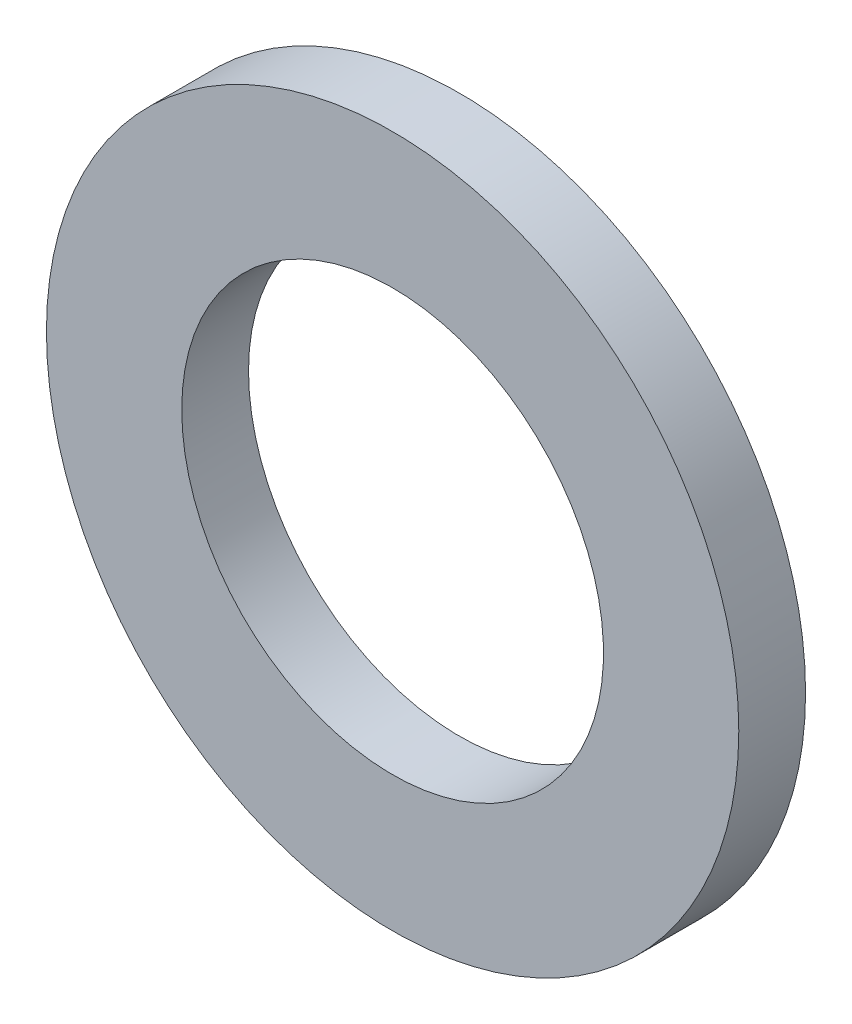
ISO-10303-21;
HEADER;
FILE_DESCRIPTION(('STEP AP214'),'2;1');
FILE_NAME('part.step','',(''),(''),'','','');
FILE_SCHEMA(('AUTOMOTIVE_DESIGN { 1 0 10303 214 1 1 1 1 }'));
ENDSEC;
DATA;
#1=APPLICATION_CONTEXT('core data for automotive mechanical design processes');
#2=APPLICATION_PROTOCOL_DEFINITION('international standard','automotive_design',2000,#1);
#3=PRODUCT_CONTEXT('',#1,'mechanical');
#4=PRODUCT('Part','Part','',(#3));
#5=PRODUCT_RELATED_PRODUCT_CATEGORY('part','',(#4));
#6=PRODUCT_DEFINITION_FORMATION('','',#4);
#7=PRODUCT_DEFINITION_CONTEXT('part definition',#1,'design');
#8=PRODUCT_DEFINITION('design','',#6,#7);
#9=PRODUCT_DEFINITION_SHAPE('','',#8);
#10=(LENGTH_UNIT() NAMED_UNIT(*) SI_UNIT(.MILLI.,.METRE.));
#11=(NAMED_UNIT(*) PLANE_ANGLE_UNIT() SI_UNIT($,.RADIAN.));
#12=(NAMED_UNIT(*) SI_UNIT($,.STERADIAN.) SOLID_ANGLE_UNIT());
#13=UNCERTAINTY_MEASURE_WITH_UNIT(LENGTH_MEASURE(1.E-05),#10,'distance_accuracy_value','');
#14=(GEOMETRIC_REPRESENTATION_CONTEXT(3) GLOBAL_UNCERTAINTY_ASSIGNED_CONTEXT((#13)) GLOBAL_UNIT_ASSIGNED_CONTEXT((#10,
#11,#12)) REPRESENTATION_CONTEXT('',''));
#15=CARTESIAN_POINT('',(0.,0.,0.));
#16=DIRECTION('',(0.,0.,1.));
#17=DIRECTION('',(1.,0.,0.));
#18=AXIS2_PLACEMENT_3D('',#15,#16,#17);
#19=CARTESIAN_POINT('',(0.,0.,0.95));
#20=DIRECTION('',(0.,0.,1.));
#21=DIRECTION('',(1.,0.,0.));
#22=AXIS2_PLACEMENT_3D('',#19,#20,#21);
#23=PLANE('',#22);
#24=CARTESIAN_POINT('',(0.,0.,0.95));
#25=DIRECTION('',(0.,0.,1.));
#26=DIRECTION('',(1.,0.,0.));
#27=AXIS2_PLACEMENT_3D('',#24,#25,#26);
#28=CIRCLE('',#27,4.925);
#29=CARTESIAN_POINT('',(-4.925,0.,0.95));
#30=VERTEX_POINT('',#29);
#31=EDGE_CURVE('E12',#30,#30,#28,.T.);
#32=ORIENTED_EDGE('',*,*,#31,.T.);
#33=EDGE_LOOP('',(#32));
#34=FACE_BOUND('',#33,.T.);
#35=CARTESIAN_POINT('',(0.,0.,0.95));
#36=DIRECTION('',(0.,0.,1.));
#37=DIRECTION('',(1.,0.,0.));
#38=AXIS2_PLACEMENT_3D('',#35,#36,#37);
#39=CIRCLE('',#38,3.);
#40=CARTESIAN_POINT('',(-3.,0.,0.95));
#41=VERTEX_POINT('',#40);
#42=EDGE_CURVE('E56',#41,#41,#39,.T.);
#43=ORIENTED_EDGE('',*,*,#42,.F.);
#44=EDGE_LOOP('',(#43));
#45=FACE_BOUND('',#44,.T.);
#46=ADVANCED_FACE('F44',(#34,#45),#23,.T.);
#47=CARTESIAN_POINT('',(0.,0.,0.));
#48=DIRECTION('',(0.,0.,1.));
#49=DIRECTION('',(1.,0.,0.));
#50=AXIS2_PLACEMENT_3D('',#47,#48,#49);
#51=PLANE('',#50);
#52=CARTESIAN_POINT('',(0.,0.,0.));
#53=DIRECTION('',(0.,0.,1.));
#54=DIRECTION('',(1.,0.,0.));
#55=AXIS2_PLACEMENT_3D('',#52,#53,#54);
#56=CIRCLE('',#55,4.925);
#57=CARTESIAN_POINT('',(-4.925,0.,0.));
#58=VERTEX_POINT('',#57);
#59=EDGE_CURVE('E48',#58,#58,#56,.T.);
#60=ORIENTED_EDGE('',*,*,#59,.F.);
#61=EDGE_LOOP('',(#60));
#62=FACE_BOUND('',#61,.T.);
#63=CARTESIAN_POINT('',(0.,0.,0.));
#64=DIRECTION('',(0.,0.,1.));
#65=DIRECTION('',(1.,0.,0.));
#66=AXIS2_PLACEMENT_3D('',#63,#64,#65);
#67=CIRCLE('',#66,3.);
#68=CARTESIAN_POINT('',(-3.,0.,0.));
#69=VERTEX_POINT('',#68);
#70=EDGE_CURVE('E58',#69,#69,#67,.T.);
#71=ORIENTED_EDGE('',*,*,#70,.T.);
#72=EDGE_LOOP('',(#71));
#73=FACE_BOUND('',#72,.T.);
#74=ADVANCED_FACE('F69',(#62,#73),#51,.F.);
#75=CARTESIAN_POINT('',(0.,0.,0.95));
#76=DIRECTION('',(0.,0.,-1.));
#77=DIRECTION('',(-1.,0.,0.));
#78=AXIS2_PLACEMENT_3D('',#75,#76,#77);
#79=CYLINDRICAL_SURFACE('',#78,4.925);
#80=CARTESIAN_POINT('',(-4.925,0.,0.95));
#81=CARTESIAN_POINT('',(-4.925,0.,0.940104166666667));
#82=CARTESIAN_POINT('',(-4.925,0.,0.930208333333333));
#83=CARTESIAN_POINT('',(-4.925,0.,0.910416666666667));
#84=CARTESIAN_POINT('',(-4.925,0.,0.900520833333333));
#85=CARTESIAN_POINT('',(-4.925,0.,0.880729166666667));
#86=CARTESIAN_POINT('',(-4.925,0.,0.870833333333333));
#87=CARTESIAN_POINT('',(-4.925,0.,0.851041666666667));
#88=CARTESIAN_POINT('',(-4.925,0.,0.841145833333333));
#89=CARTESIAN_POINT('',(-4.925,0.,0.821354166666667));
#90=CARTESIAN_POINT('',(-4.925,0.,0.811458333333333));
#91=CARTESIAN_POINT('',(-4.925,0.,0.791666666666667));
#92=CARTESIAN_POINT('',(-4.925,0.,0.781770833333333));
#93=CARTESIAN_POINT('',(-4.925,0.,0.761979166666667));
#94=CARTESIAN_POINT('',(-4.925,0.,0.752083333333333));
#95=CARTESIAN_POINT('',(-4.925,0.,0.732291666666667));
#96=CARTESIAN_POINT('',(-4.925,0.,0.722395833333333));
#97=CARTESIAN_POINT('',(-4.925,0.,0.702604166666667));
#98=CARTESIAN_POINT('',(-4.925,0.,0.692708333333333));
#99=CARTESIAN_POINT('',(-4.925,0.,0.672916666666667));
#100=CARTESIAN_POINT('',(-4.925,0.,0.663020833333333));
#101=CARTESIAN_POINT('',(-4.925,0.,0.643229166666667));
#102=CARTESIAN_POINT('',(-4.925,0.,0.633333333333333));
#103=CARTESIAN_POINT('',(-4.925,0.,0.613541666666667));
#104=CARTESIAN_POINT('',(-4.925,0.,0.603645833333333));
#105=CARTESIAN_POINT('',(-4.925,0.,0.583854166666667));
#106=CARTESIAN_POINT('',(-4.925,0.,0.573958333333333));
#107=CARTESIAN_POINT('',(-4.925,0.,0.554166666666667));
#108=CARTESIAN_POINT('',(-4.925,0.,0.544270833333333));
#109=CARTESIAN_POINT('',(-4.925,0.,0.524479166666667));
#110=CARTESIAN_POINT('',(-4.925,0.,0.514583333333333));
#111=CARTESIAN_POINT('',(-4.925,0.,0.494791666666667));
#112=CARTESIAN_POINT('',(-4.925,0.,0.484895833333333));
#113=CARTESIAN_POINT('',(-4.925,0.,0.465104166666667));
#114=CARTESIAN_POINT('',(-4.925,0.,0.455208333333333));
#115=CARTESIAN_POINT('',(-4.925,0.,0.435416666666667));
#116=CARTESIAN_POINT('',(-4.925,0.,0.425520833333333));
#117=CARTESIAN_POINT('',(-4.925,0.,0.405729166666667));
#118=CARTESIAN_POINT('',(-4.925,0.,0.395833333333333));
#119=CARTESIAN_POINT('',(-4.925,0.,0.376041666666667));
#120=CARTESIAN_POINT('',(-4.925,0.,0.366145833333333));
#121=CARTESIAN_POINT('',(-4.925,0.,0.346354166666667));
#122=CARTESIAN_POINT('',(-4.925,0.,0.336458333333333));
#123=CARTESIAN_POINT('',(-4.925,0.,0.316666666666667));
#124=CARTESIAN_POINT('',(-4.925,0.,0.306770833333333));
#125=CARTESIAN_POINT('',(-4.925,0.,0.286979166666667));
#126=CARTESIAN_POINT('',(-4.925,0.,0.277083333333333));
#127=CARTESIAN_POINT('',(-4.925,0.,0.257291666666667));
#128=CARTESIAN_POINT('',(-4.925,0.,0.247395833333333));
#129=CARTESIAN_POINT('',(-4.925,0.,0.227604166666667));
#130=CARTESIAN_POINT('',(-4.925,0.,0.217708333333333));
#131=CARTESIAN_POINT('',(-4.925,0.,0.197916666666667));
#132=CARTESIAN_POINT('',(-4.925,0.,0.188020833333333));
#133=CARTESIAN_POINT('',(-4.925,0.,0.168229166666667));
#134=CARTESIAN_POINT('',(-4.925,0.,0.158333333333333));
#135=CARTESIAN_POINT('',(-4.925,0.,0.138541666666667));
#136=CARTESIAN_POINT('',(-4.925,0.,0.128645833333333));
#137=CARTESIAN_POINT('',(-4.925,0.,0.108854166666667));
#138=CARTESIAN_POINT('',(-4.925,0.,0.0989583333333333));
#139=CARTESIAN_POINT('',(-4.925,0.,0.0791666666666666));
#140=CARTESIAN_POINT('',(-4.925,0.,0.0692708333333333));
#141=CARTESIAN_POINT('',(-4.925,0.,0.0494791666666666));
#142=CARTESIAN_POINT('',(-4.925,0.,0.0395833333333333));
#143=CARTESIAN_POINT('',(-4.925,0.,0.0197916666666666));
#144=CARTESIAN_POINT('',(-4.925,0.,0.00989583333333331));
#145=CARTESIAN_POINT('',(-4.925,0.,0.));
#146=B_SPLINE_CURVE_WITH_KNOTS('',3,(#80,#81,#82,#83,#84,#85,#86,#87,#88,#89,#90,#91,#92,#93,
#94,#95,#96,#97,#98,#99,#100,#101,#102,#103,#104,#105,#106,#107,#108,#109,#110,#111,#112,#113,
#114,#115,#116,#117,#118,#119,#120,#121,#122,#123,#124,#125,#126,#127,#128,#129,#130,#131,#132,
#133,#134,#135,#136,#137,#138,#139,#140,#141,#142,#143,#144,#145),.UNSPECIFIED.,.F.,.F.,(4,2,2,
2,2,2,2,2,2,2,2,2,2,2,2,2,2,2,2,2,2,2,2,2,2,2,2,2,2,2,2,2,4),(0.,0.0296875,0.059375,
0.0890624999999999,0.11875,0.1484375,0.178125,0.2078125,0.2375,0.2671875,0.296875,0.3265625,
0.35625,0.3859375,0.415625,0.4453125,0.475,0.5046875,0.534375,0.5640625,0.59375,0.6234375,
0.653125,0.6828125,0.7125,0.7421875,0.771875,0.8015625,0.83125,0.8609375,0.890625,0.9203125,
0.95),.UNSPECIFIED.);
#147=EDGE_CURVE('BSEAM46',#30,#58,#146,.T.);
#148=ORIENTED_EDGE('',*,*,#31,.F.);
#149=ORIENTED_EDGE('',*,*,#59,.T.);
#150=ORIENTED_EDGE('',*,*,#147,.T.);
#151=ORIENTED_EDGE('',*,*,#147,.F.);
#152=EDGE_LOOP('',(#148,#150,#149,#151));
#153=FACE_BOUND('',#152,.T.);
#154=ADVANCED_FACE('F46',(#153),#79,.T.);
#155=CARTESIAN_POINT('',(0.,0.,0.95));
#156=DIRECTION('',(0.,0.,-1.));
#157=DIRECTION('',(-1.,0.,0.));
#158=AXIS2_PLACEMENT_3D('',#155,#156,#157);
#159=CYLINDRICAL_SURFACE('',#158,3.);
#160=CARTESIAN_POINT('',(-3.,0.,0.95));
#161=CARTESIAN_POINT('',(-3.,0.,0.940104166666667));
#162=CARTESIAN_POINT('',(-3.,0.,0.930208333333333));
#163=CARTESIAN_POINT('',(-3.,0.,0.910416666666667));
#164=CARTESIAN_POINT('',(-3.,0.,0.900520833333333));
#165=CARTESIAN_POINT('',(-3.,0.,0.880729166666667));
#166=CARTESIAN_POINT('',(-3.,0.,0.870833333333333));
#167=CARTESIAN_POINT('',(-3.,0.,0.851041666666667));
#168=CARTESIAN_POINT('',(-3.,0.,0.841145833333333));
#169=CARTESIAN_POINT('',(-3.,0.,0.821354166666667));
#170=CARTESIAN_POINT('',(-3.,0.,0.811458333333333));
#171=CARTESIAN_POINT('',(-3.,0.,0.791666666666667));
#172=CARTESIAN_POINT('',(-3.,0.,0.781770833333333));
#173=CARTESIAN_POINT('',(-3.,0.,0.761979166666667));
#174=CARTESIAN_POINT('',(-3.,0.,0.752083333333333));
#175=CARTESIAN_POINT('',(-3.,0.,0.732291666666667));
#176=CARTESIAN_POINT('',(-3.,0.,0.722395833333333));
#177=CARTESIAN_POINT('',(-3.,0.,0.702604166666667));
#178=CARTESIAN_POINT('',(-3.,0.,0.692708333333333));
#179=CARTESIAN_POINT('',(-3.,0.,0.672916666666667));
#180=CARTESIAN_POINT('',(-3.,0.,0.663020833333333));
#181=CARTESIAN_POINT('',(-3.,0.,0.643229166666667));
#182=CARTESIAN_POINT('',(-3.,0.,0.633333333333333));
#183=CARTESIAN_POINT('',(-3.,0.,0.613541666666667));
#184=CARTESIAN_POINT('',(-3.,0.,0.603645833333333));
#185=CARTESIAN_POINT('',(-3.,0.,0.583854166666667));
#186=CARTESIAN_POINT('',(-3.,0.,0.573958333333333));
#187=CARTESIAN_POINT('',(-3.,0.,0.554166666666667));
#188=CARTESIAN_POINT('',(-3.,0.,0.544270833333333));
#189=CARTESIAN_POINT('',(-3.,0.,0.524479166666667));
#190=CARTESIAN_POINT('',(-3.,0.,0.514583333333333));
#191=CARTESIAN_POINT('',(-3.,0.,0.494791666666667));
#192=CARTESIAN_POINT('',(-3.,0.,0.484895833333333));
#193=CARTESIAN_POINT('',(-3.,0.,0.465104166666667));
#194=CARTESIAN_POINT('',(-3.,0.,0.455208333333333));
#195=CARTESIAN_POINT('',(-3.,0.,0.435416666666667));
#196=CARTESIAN_POINT('',(-3.,0.,0.425520833333333));
#197=CARTESIAN_POINT('',(-3.,0.,0.405729166666667));
#198=CARTESIAN_POINT('',(-3.,0.,0.395833333333333));
#199=CARTESIAN_POINT('',(-3.,0.,0.376041666666667));
#200=CARTESIAN_POINT('',(-3.,0.,0.366145833333333));
#201=CARTESIAN_POINT('',(-3.,0.,0.346354166666667));
#202=CARTESIAN_POINT('',(-3.,0.,0.336458333333333));
#203=CARTESIAN_POINT('',(-3.,0.,0.316666666666667));
#204=CARTESIAN_POINT('',(-3.,0.,0.306770833333333));
#205=CARTESIAN_POINT('',(-3.,0.,0.286979166666667));
#206=CARTESIAN_POINT('',(-3.,0.,0.277083333333333));
#207=CARTESIAN_POINT('',(-3.,0.,0.257291666666667));
#208=CARTESIAN_POINT('',(-3.,0.,0.247395833333333));
#209=CARTESIAN_POINT('',(-3.,0.,0.227604166666667));
#210=CARTESIAN_POINT('',(-3.,0.,0.217708333333333));
#211=CARTESIAN_POINT('',(-3.,0.,0.197916666666667));
#212=CARTESIAN_POINT('',(-3.,0.,0.188020833333333));
#213=CARTESIAN_POINT('',(-3.,0.,0.168229166666667));
#214=CARTESIAN_POINT('',(-3.,0.,0.158333333333333));
#215=CARTESIAN_POINT('',(-3.,0.,0.138541666666667));
#216=CARTESIAN_POINT('',(-3.,0.,0.128645833333333));
#217=CARTESIAN_POINT('',(-3.,0.,0.108854166666667));
#218=CARTESIAN_POINT('',(-3.,0.,0.0989583333333334));
#219=CARTESIAN_POINT('',(-3.,0.,0.0791666666666667));
#220=CARTESIAN_POINT('',(-3.,0.,0.0692708333333333));
#221=CARTESIAN_POINT('',(-3.,0.,0.0494791666666666));
#222=CARTESIAN_POINT('',(-3.,0.,0.0395833333333333));
#223=CARTESIAN_POINT('',(-3.,0.,0.0197916666666667));
#224=CARTESIAN_POINT('',(-3.,0.,0.00989583333333332));
#225=CARTESIAN_POINT('',(-3.,0.,0.));
#226=B_SPLINE_CURVE_WITH_KNOTS('',3,(#160,#161,#162,#163,#164,#165,#166,#167,#168,#169,#170,
#171,#172,#173,#174,#175,#176,#177,#178,#179,#180,#181,#182,#183,#184,#185,#186,#187,#188,#189,
#190,#191,#192,#193,#194,#195,#196,#197,#198,#199,#200,#201,#202,#203,#204,#205,#206,#207,#208,
#209,#210,#211,#212,#213,#214,#215,#216,#217,#218,#219,#220,#221,#222,#223,#224,#225),
.UNSPECIFIED.,.F.,.F.,(4,2,2,2,2,2,2,2,2,2,2,2,2,2,2,2,2,2,2,2,2,2,2,2,2,2,2,2,2,2,2,2,4),(0.,
0.0296875000000001,0.0593750000000001,0.0890625000000001,0.11875,0.1484375,0.178125,0.2078125,
0.2375,0.2671875,0.296875,0.3265625,0.35625,0.3859375,0.415625,0.4453125,0.475,0.5046875,
0.534375,0.5640625,0.59375,0.6234375,0.653125,0.6828125,0.7125,0.7421875,0.771875,0.8015625,
0.83125,0.8609375,0.890625,0.9203125,0.95),.UNSPECIFIED.);
#227=EDGE_CURVE('BSEAM65',#41,#69,#226,.T.);
#228=ORIENTED_EDGE('',*,*,#42,.T.);
#229=ORIENTED_EDGE('',*,*,#70,.F.);
#230=ORIENTED_EDGE('',*,*,#227,.T.);
#231=ORIENTED_EDGE('',*,*,#227,.F.);
#232=EDGE_LOOP('',(#228,#230,#229,#231));
#233=FACE_BOUND('',#232,.T.);
#234=ADVANCED_FACE('F65',(#233),#159,.F.);
#235=CLOSED_SHELL('',(#46,#74,#154,#234));
#236=MANIFOLD_SOLID_BREP('B2',#235);
#237=ADVANCED_BREP_SHAPE_REPRESENTATION('',(#18,#236),#14);
#238=SHAPE_DEFINITION_REPRESENTATION(#9,#237);
ENDSEC;
END-ISO-10303-21;
